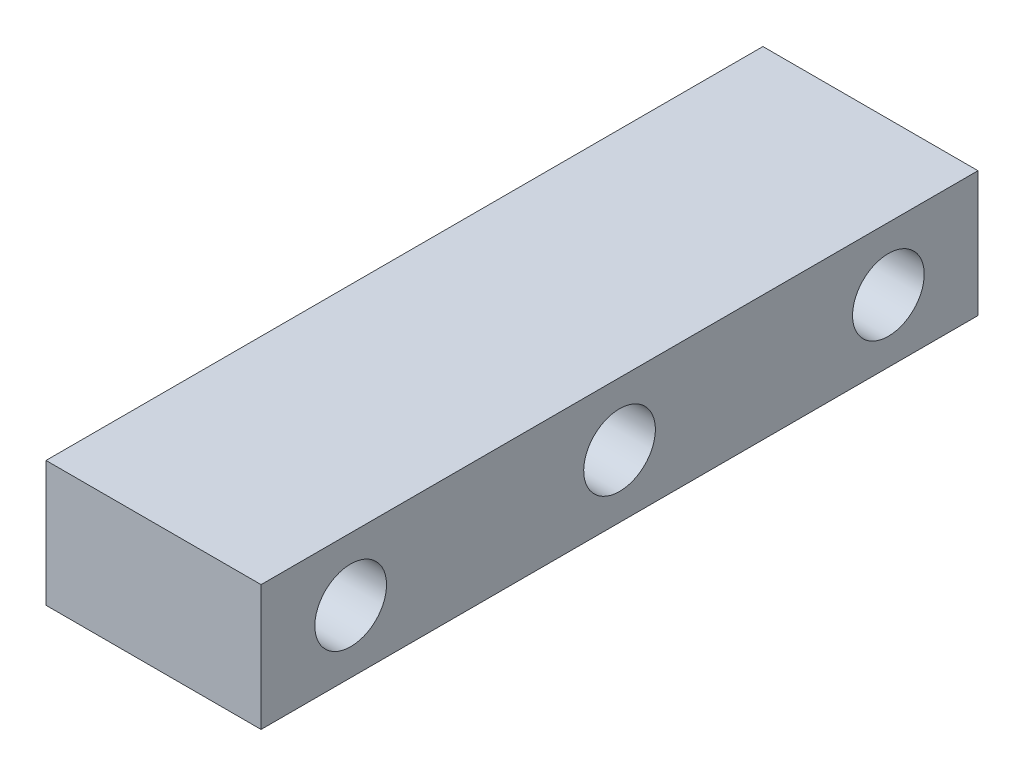
ISO-10303-21;
HEADER;
FILE_DESCRIPTION(('STEP AP214'),'2;1');
FILE_NAME('part.step','',(''),(''),'','','');
FILE_SCHEMA(('AUTOMOTIVE_DESIGN { 1 0 10303 214 1 1 1 1 }'));
ENDSEC;
DATA;
#1=APPLICATION_CONTEXT('core data for automotive mechanical design processes');
#2=APPLICATION_PROTOCOL_DEFINITION('international standard','automotive_design',2000,#1);
#3=PRODUCT_CONTEXT('',#1,'mechanical');
#4=PRODUCT('Part','Part','',(#3));
#5=PRODUCT_RELATED_PRODUCT_CATEGORY('part','',(#4));
#6=PRODUCT_DEFINITION_FORMATION('','',#4);
#7=PRODUCT_DEFINITION_CONTEXT('part definition',#1,'design');
#8=PRODUCT_DEFINITION('design','',#6,#7);
#9=PRODUCT_DEFINITION_SHAPE('','',#8);
#10=(LENGTH_UNIT() NAMED_UNIT(*) SI_UNIT(.MILLI.,.METRE.));
#11=(NAMED_UNIT(*) PLANE_ANGLE_UNIT() SI_UNIT($,.RADIAN.));
#12=(NAMED_UNIT(*) SI_UNIT($,.STERADIAN.) SOLID_ANGLE_UNIT());
#13=UNCERTAINTY_MEASURE_WITH_UNIT(LENGTH_MEASURE(1.E-05),#10,'distance_accuracy_value','');
#14=(GEOMETRIC_REPRESENTATION_CONTEXT(3) GLOBAL_UNCERTAINTY_ASSIGNED_CONTEXT((#13)) GLOBAL_UNIT_ASSIGNED_CONTEXT((#10,
#11,#12)) REPRESENTATION_CONTEXT('',''));
#15=CARTESIAN_POINT('',(0.,0.,0.));
#16=DIRECTION('',(0.,0.,1.));
#17=DIRECTION('',(1.,0.,0.));
#18=AXIS2_PLACEMENT_3D('',#15,#16,#17);
#19=CARTESIAN_POINT('',(0.,0.,90.));
#20=DIRECTION('',(1.,0.,0.));
#21=DIRECTION('',(0.,1.,0.));
#22=AXIS2_PLACEMENT_3D('',#19,#20,#21);
#23=PLANE('',#22);
#24=CARTESIAN_POINT('',(0.,-7.,75.));
#25=DIRECTION('',(-1.,0.,0.));
#26=DIRECTION('',(0.,-1.,0.));
#27=AXIS2_PLACEMENT_3D('',#24,#25,#26);
#28=CIRCLE('',#27,4.00000000000001);
#29=CARTESIAN_POINT('',(0.,-11.,75.));
#30=VERTEX_POINT('',#29);
#31=EDGE_CURVE('E92',#30,#30,#28,.T.);
#32=ORIENTED_EDGE('',*,*,#31,.F.);
#33=EDGE_LOOP('',(#32));
#34=FACE_BOUND('',#33,.T.);
#35=CARTESIAN_POINT('',(0.,-7.,45.));
#36=DIRECTION('',(-1.,0.,0.));
#37=DIRECTION('',(0.,-1.,0.));
#38=AXIS2_PLACEMENT_3D('',#35,#36,#37);
#39=CIRCLE('',#38,4.00000000000001);
#40=CARTESIAN_POINT('',(0.,-11.,45.));
#41=VERTEX_POINT('',#40);
#42=EDGE_CURVE('E99',#41,#41,#39,.T.);
#43=ORIENTED_EDGE('',*,*,#42,.F.);
#44=EDGE_LOOP('',(#43));
#45=FACE_BOUND('',#44,.T.);
#46=CARTESIAN_POINT('',(0.,-7.,15.));
#47=DIRECTION('',(-1.,0.,0.));
#48=DIRECTION('',(0.,-1.,0.));
#49=AXIS2_PLACEMENT_3D('',#46,#47,#48);
#50=CIRCLE('',#49,4.);
#51=CARTESIAN_POINT('',(0.,-11.,15.));
#52=VERTEX_POINT('',#51);
#53=EDGE_CURVE('E103',#52,#52,#50,.T.);
#54=ORIENTED_EDGE('',*,*,#53,.F.);
#55=EDGE_LOOP('',(#54));
#56=FACE_BOUND('',#55,.T.);
#57=DIRECTION('',(0.,0.,-1.));
#58=VECTOR('',#57,1.);
#59=CARTESIAN_POINT('',(0.,0.,90.));
#60=LINE('',#59,#58);
#61=CARTESIAN_POINT('',(0.,0.,85.));
#62=VERTEX_POINT('',#61);
#63=CARTESIAN_POINT('',(0.,0.,5.00000000000003));
#64=VERTEX_POINT('',#63);
#65=EDGE_CURVE('E84',#62,#64,#60,.T.);
#66=ORIENTED_EDGE('',*,*,#65,.T.);
#67=DIRECTION('',(0.,-1.,0.));
#68=VECTOR('',#67,1.);
#69=CARTESIAN_POINT('',(0.,0.,5.));
#70=LINE('',#69,#68);
#71=CARTESIAN_POINT('',(0.,-14.,5.));
#72=VERTEX_POINT('',#71);
#73=EDGE_CURVE('E46',#64,#72,#70,.T.);
#74=ORIENTED_EDGE('',*,*,#73,.T.);
#75=DIRECTION('',(0.,0.,-1.));
#76=VECTOR('',#75,1.);
#77=CARTESIAN_POINT('',(0.,-14.,90.));
#78=LINE('',#77,#76);
#79=CARTESIAN_POINT('',(0.,-14.,85.));
#80=VERTEX_POINT('',#79);
#81=EDGE_CURVE('E11',#80,#72,#78,.T.);
#82=ORIENTED_EDGE('',*,*,#81,.F.);
#83=DIRECTION('',(0.,1.,0.));
#84=VECTOR('',#83,1.);
#85=CARTESIAN_POINT('',(0.,0.,85.));
#86=LINE('',#85,#84);
#87=EDGE_CURVE('E90',#80,#62,#86,.T.);
#88=ORIENTED_EDGE('',*,*,#87,.T.);
#89=EDGE_LOOP('',(#66,#74,#82,#88));
#90=FACE_BOUND('',#89,.T.);
#91=ADVANCED_FACE('F30',(#34,#45,#56,#90),#23,.F.);
#92=CARTESIAN_POINT('',(0.,-14.,90.));
#93=DIRECTION('',(0.,1.,0.));
#94=DIRECTION('',(0.,0.,1.));
#95=AXIS2_PLACEMENT_3D('',#92,#93,#94);
#96=PLANE('',#95);
#97=ORIENTED_EDGE('',*,*,#81,.T.);
#98=DIRECTION('',(1.,0.,0.));
#99=VECTOR('',#98,1.);
#100=CARTESIAN_POINT('',(0.,-14.,5.));
#101=LINE('',#100,#99);
#102=CARTESIAN_POINT('',(24.,-14.,5.));
#103=VERTEX_POINT('',#102);
#104=EDGE_CURVE('E70',#72,#103,#101,.T.);
#105=ORIENTED_EDGE('',*,*,#104,.T.);
#106=DIRECTION('',(0.,0.,-1.));
#107=VECTOR('',#106,1.);
#108=CARTESIAN_POINT('',(24.,-14.,90.));
#109=LINE('',#108,#107);
#110=CARTESIAN_POINT('',(24.,-14.,85.));
#111=VERTEX_POINT('',#110);
#112=EDGE_CURVE('E38',#111,#103,#109,.T.);
#113=ORIENTED_EDGE('',*,*,#112,.F.);
#114=DIRECTION('',(1.,0.,0.));
#115=VECTOR('',#114,1.);
#116=CARTESIAN_POINT('',(0.,-14.,85.));
#117=LINE('',#116,#115);
#118=EDGE_CURVE('E88',#80,#111,#117,.T.);
#119=ORIENTED_EDGE('',*,*,#118,.F.);
#120=EDGE_LOOP('',(#97,#105,#113,#119));
#121=FACE_BOUND('',#120,.T.);
#122=ADVANCED_FACE('F87',(#121),#96,.F.);
#123=CARTESIAN_POINT('',(24.,0.,90.));
#124=DIRECTION('',(-1.,0.,0.));
#125=DIRECTION('',(0.,0.,1.));
#126=AXIS2_PLACEMENT_3D('',#123,#124,#125);
#127=PLANE('',#126);
#128=CARTESIAN_POINT('',(24.,-7.,75.));
#129=DIRECTION('',(-1.,0.,0.));
#130=DIRECTION('',(0.,0.,1.));
#131=AXIS2_PLACEMENT_3D('',#128,#129,#130);
#132=CIRCLE('',#131,4.00000000000001);
#133=CARTESIAN_POINT('',(24.,-11.,75.));
#134=VERTEX_POINT('',#133);
#135=EDGE_CURVE('E33',#134,#134,#132,.T.);
#136=ORIENTED_EDGE('',*,*,#135,.T.);
#137=EDGE_LOOP('',(#136));
#138=FACE_BOUND('',#137,.T.);
#139=CARTESIAN_POINT('',(24.,-7.,45.));
#140=DIRECTION('',(-1.,0.,0.));
#141=DIRECTION('',(0.,0.,1.));
#142=AXIS2_PLACEMENT_3D('',#139,#140,#141);
#143=CIRCLE('',#142,4.00000000000001);
#144=CARTESIAN_POINT('',(24.,-11.,45.));
#145=VERTEX_POINT('',#144);
#146=EDGE_CURVE('E102',#145,#145,#143,.T.);
#147=ORIENTED_EDGE('',*,*,#146,.T.);
#148=EDGE_LOOP('',(#147));
#149=FACE_BOUND('',#148,.T.);
#150=CARTESIAN_POINT('',(24.,-7.,15.));
#151=DIRECTION('',(-1.,0.,0.));
#152=DIRECTION('',(0.,0.,1.));
#153=AXIS2_PLACEMENT_3D('',#150,#151,#152);
#154=CIRCLE('',#153,4.);
#155=CARTESIAN_POINT('',(24.,-11.,15.));
#156=VERTEX_POINT('',#155);
#157=EDGE_CURVE('E106',#156,#156,#154,.T.);
#158=ORIENTED_EDGE('',*,*,#157,.T.);
#159=EDGE_LOOP('',(#158));
#160=FACE_BOUND('',#159,.T.);
#161=ORIENTED_EDGE('',*,*,#112,.T.);
#162=DIRECTION('',(0.,-1.,0.));
#163=VECTOR('',#162,1.);
#164=CARTESIAN_POINT('',(24.,0.,5.));
#165=LINE('',#164,#163);
#166=CARTESIAN_POINT('',(24.,0.,5.));
#167=VERTEX_POINT('',#166);
#168=EDGE_CURVE('E73',#167,#103,#165,.T.);
#169=ORIENTED_EDGE('',*,*,#168,.F.);
#170=DIRECTION('',(0.,0.,-1.));
#171=VECTOR('',#170,1.);
#172=CARTESIAN_POINT('',(24.,0.,90.));
#173=LINE('',#172,#171);
#174=CARTESIAN_POINT('',(24.,0.,85.));
#175=VERTEX_POINT('',#174);
#176=EDGE_CURVE('E108',#175,#167,#173,.T.);
#177=ORIENTED_EDGE('',*,*,#176,.F.);
#178=DIRECTION('',(0.,1.,0.));
#179=VECTOR('',#178,1.);
#180=CARTESIAN_POINT('',(24.,0.,85.));
#181=LINE('',#180,#179);
#182=EDGE_CURVE('E54',#111,#175,#181,.T.);
#183=ORIENTED_EDGE('',*,*,#182,.F.);
#184=EDGE_LOOP('',(#161,#169,#177,#183));
#185=FACE_BOUND('',#184,.T.);
#186=ADVANCED_FACE('F116',(#138,#149,#160,#185),#127,.F.);
#187=CARTESIAN_POINT('',(0.,0.,90.));
#188=DIRECTION('',(0.,-1.,0.));
#189=DIRECTION('',(0.,0.,-1.));
#190=AXIS2_PLACEMENT_3D('',#187,#188,#189);
#191=PLANE('',#190);
#192=ORIENTED_EDGE('',*,*,#176,.T.);
#193=DIRECTION('',(1.,0.,0.));
#194=VECTOR('',#193,1.);
#195=CARTESIAN_POINT('',(0.,0.,5.));
#196=LINE('',#195,#194);
#197=EDGE_CURVE('E77',#64,#167,#196,.T.);
#198=ORIENTED_EDGE('',*,*,#197,.F.);
#199=ORIENTED_EDGE('',*,*,#65,.F.);
#200=DIRECTION('',(1.,0.,0.));
#201=VECTOR('',#200,1.);
#202=CARTESIAN_POINT('',(0.,0.,85.));
#203=LINE('',#202,#201);
#204=EDGE_CURVE('E89',#62,#175,#203,.T.);
#205=ORIENTED_EDGE('',*,*,#204,.T.);
#206=EDGE_LOOP('',(#192,#198,#199,#205));
#207=FACE_BOUND('',#206,.T.);
#208=ADVANCED_FACE('F132',(#207),#191,.F.);
#209=CARTESIAN_POINT('',(90.,-6.99999999999999,15.));
#210=DIRECTION('',(-1.,0.,0.));
#211=DIRECTION('',(0.,-1.,0.));
#212=AXIS2_PLACEMENT_3D('',#209,#210,#211);
#213=CYLINDRICAL_SURFACE('',#212,4.);
#214=CARTESIAN_POINT('',(0.,-11.,15.));
#215=CARTESIAN_POINT('',(0.250000000000014,-11.,15.));
#216=CARTESIAN_POINT('',(0.500000000000014,-11.,15.));
#217=CARTESIAN_POINT('',(1.00000000000001,-11.,15.));
#218=CARTESIAN_POINT('',(1.25000000000002,-11.,15.));
#219=CARTESIAN_POINT('',(1.75000000000002,-11.,15.));
#220=CARTESIAN_POINT('',(2.00000000000002,-11.,15.));
#221=CARTESIAN_POINT('',(2.50000000000002,-11.,15.));
#222=CARTESIAN_POINT('',(2.75000000000002,-11.,15.));
#223=CARTESIAN_POINT('',(3.25000000000002,-11.,15.));
#224=CARTESIAN_POINT('',(3.50000000000002,-11.,15.));
#225=CARTESIAN_POINT('',(4.00000000000002,-11.,15.));
#226=CARTESIAN_POINT('',(4.25000000000002,-11.,15.));
#227=CARTESIAN_POINT('',(4.75000000000002,-11.,15.));
#228=CARTESIAN_POINT('',(5.00000000000002,-11.,15.));
#229=CARTESIAN_POINT('',(5.50000000000002,-11.,15.));
#230=CARTESIAN_POINT('',(5.75000000000002,-11.,15.));
#231=CARTESIAN_POINT('',(6.25000000000002,-11.,15.));
#232=CARTESIAN_POINT('',(6.50000000000001,-11.,15.));
#233=CARTESIAN_POINT('',(7.00000000000001,-11.,15.));
#234=CARTESIAN_POINT('',(7.25000000000001,-11.,15.));
#235=CARTESIAN_POINT('',(7.75000000000001,-11.,15.));
#236=CARTESIAN_POINT('',(8.00000000000001,-11.,15.));
#237=CARTESIAN_POINT('',(8.50000000000001,-11.,15.));
#238=CARTESIAN_POINT('',(8.75000000000001,-11.,15.));
#239=CARTESIAN_POINT('',(9.25000000000001,-11.,15.));
#240=CARTESIAN_POINT('',(9.50000000000001,-11.,15.));
#241=CARTESIAN_POINT('',(10.,-11.,15.));
#242=CARTESIAN_POINT('',(10.25,-11.,15.));
#243=CARTESIAN_POINT('',(10.75,-11.,15.));
#244=CARTESIAN_POINT('',(11.,-11.,15.));
#245=CARTESIAN_POINT('',(11.5,-11.,15.));
#246=CARTESIAN_POINT('',(11.75,-11.,15.));
#247=CARTESIAN_POINT('',(12.25,-11.,15.));
#248=CARTESIAN_POINT('',(12.5,-11.,15.));
#249=CARTESIAN_POINT('',(13.,-11.,15.));
#250=CARTESIAN_POINT('',(13.25,-11.,15.));
#251=CARTESIAN_POINT('',(13.75,-11.,15.));
#252=CARTESIAN_POINT('',(14.,-11.,15.));
#253=CARTESIAN_POINT('',(14.5,-11.,15.));
#254=CARTESIAN_POINT('',(14.75,-11.,15.));
#255=CARTESIAN_POINT('',(15.25,-11.,15.));
#256=CARTESIAN_POINT('',(15.5,-11.,15.));
#257=CARTESIAN_POINT('',(16.,-11.,15.));
#258=CARTESIAN_POINT('',(16.25,-11.,15.));
#259=CARTESIAN_POINT('',(16.75,-11.,15.));
#260=CARTESIAN_POINT('',(17.,-11.,15.));
#261=CARTESIAN_POINT('',(17.5,-11.,15.));
#262=CARTESIAN_POINT('',(17.75,-11.,15.));
#263=CARTESIAN_POINT('',(18.25,-11.,15.));
#264=CARTESIAN_POINT('',(18.5,-11.,15.));
#265=CARTESIAN_POINT('',(19.,-11.,15.));
#266=CARTESIAN_POINT('',(19.25,-11.,15.));
#267=CARTESIAN_POINT('',(19.75,-11.,15.));
#268=CARTESIAN_POINT('',(20.,-11.,15.));
#269=CARTESIAN_POINT('',(20.5,-11.,15.));
#270=CARTESIAN_POINT('',(20.75,-11.,15.));
#271=CARTESIAN_POINT('',(21.25,-11.,15.));
#272=CARTESIAN_POINT('',(21.5,-11.,15.));
#273=CARTESIAN_POINT('',(22.,-11.,15.));
#274=CARTESIAN_POINT('',(22.25,-11.,15.));
#275=CARTESIAN_POINT('',(22.75,-11.,15.));
#276=CARTESIAN_POINT('',(23.,-11.,15.));
#277=CARTESIAN_POINT('',(23.5,-11.,15.));
#278=CARTESIAN_POINT('',(23.75,-11.,15.));
#279=CARTESIAN_POINT('',(24.,-11.,15.));
#280=B_SPLINE_CURVE_WITH_KNOTS('',3,(#214,#215,#216,#217,#218,#219,#220,#221,#222,#223,#224,
#225,#226,#227,#228,#229,#230,#231,#232,#233,#234,#235,#236,#237,#238,#239,#240,#241,#242,#243,
#244,#245,#246,#247,#248,#249,#250,#251,#252,#253,#254,#255,#256,#257,#258,#259,#260,#261,#262,
#263,#264,#265,#266,#267,#268,#269,#270,#271,#272,#273,#274,#275,#276,#277,#278,#279),
.UNSPECIFIED.,.F.,.F.,(4,2,2,2,2,2,2,2,2,2,2,2,2,2,2,2,2,2,2,2,2,2,2,2,2,2,2,2,2,2,2,2,4),(0.,
0.750000000000001,1.5,2.25,3.,3.75,4.5,5.25,6.00000000000001,6.74999999999999,7.49999999999999,
8.24999999999999,8.99999999999999,9.74999999999999,10.5,11.25,12.,12.75,13.5,14.25,15.,15.75,
16.5,17.25,18.,18.75,19.5,20.25,21.,21.75,22.5,23.25,24.),.UNSPECIFIED.);
#281=EDGE_CURVE('BSEAM122',#52,#156,#280,.T.);
#282=ORIENTED_EDGE('',*,*,#53,.T.);
#283=ORIENTED_EDGE('',*,*,#157,.F.);
#284=ORIENTED_EDGE('',*,*,#281,.T.);
#285=ORIENTED_EDGE('',*,*,#281,.F.);
#286=EDGE_LOOP('',(#282,#284,#283,#285));
#287=FACE_BOUND('',#286,.T.);
#288=ADVANCED_FACE('F122',(#287),#213,.F.);
#289=CARTESIAN_POINT('',(90.,-6.99999999999999,45.));
#290=DIRECTION('',(-1.,0.,0.));
#291=DIRECTION('',(0.,-1.,0.));
#292=AXIS2_PLACEMENT_3D('',#289,#290,#291);
#293=CYLINDRICAL_SURFACE('',#292,4.00000000000001);
#294=CARTESIAN_POINT('',(0.,-11.,45.));
#295=CARTESIAN_POINT('',(0.250000000000014,-11.,45.));
#296=CARTESIAN_POINT('',(0.500000000000014,-11.,45.));
#297=CARTESIAN_POINT('',(1.00000000000001,-11.,45.));
#298=CARTESIAN_POINT('',(1.25000000000002,-11.,45.));
#299=CARTESIAN_POINT('',(1.75000000000002,-11.,45.));
#300=CARTESIAN_POINT('',(2.00000000000002,-11.,45.));
#301=CARTESIAN_POINT('',(2.50000000000002,-11.,45.));
#302=CARTESIAN_POINT('',(2.75000000000002,-11.,45.));
#303=CARTESIAN_POINT('',(3.25000000000002,-11.,45.));
#304=CARTESIAN_POINT('',(3.50000000000002,-11.,45.));
#305=CARTESIAN_POINT('',(4.00000000000002,-11.,45.));
#306=CARTESIAN_POINT('',(4.25000000000002,-11.,45.));
#307=CARTESIAN_POINT('',(4.75000000000002,-11.,45.));
#308=CARTESIAN_POINT('',(5.00000000000002,-11.,45.));
#309=CARTESIAN_POINT('',(5.50000000000002,-11.,45.));
#310=CARTESIAN_POINT('',(5.75000000000002,-11.,45.));
#311=CARTESIAN_POINT('',(6.25000000000002,-11.,45.));
#312=CARTESIAN_POINT('',(6.50000000000001,-11.,45.));
#313=CARTESIAN_POINT('',(7.00000000000001,-11.,45.));
#314=CARTESIAN_POINT('',(7.25000000000001,-11.,45.));
#315=CARTESIAN_POINT('',(7.75000000000001,-11.,45.));
#316=CARTESIAN_POINT('',(8.00000000000001,-11.,45.));
#317=CARTESIAN_POINT('',(8.50000000000001,-11.,45.));
#318=CARTESIAN_POINT('',(8.75000000000001,-11.,45.));
#319=CARTESIAN_POINT('',(9.25000000000001,-11.,45.));
#320=CARTESIAN_POINT('',(9.50000000000001,-11.,45.));
#321=CARTESIAN_POINT('',(10.,-11.,45.));
#322=CARTESIAN_POINT('',(10.25,-11.,45.));
#323=CARTESIAN_POINT('',(10.75,-11.,45.));
#324=CARTESIAN_POINT('',(11.,-11.,45.));
#325=CARTESIAN_POINT('',(11.5,-11.,45.));
#326=CARTESIAN_POINT('',(11.75,-11.,45.));
#327=CARTESIAN_POINT('',(12.25,-11.,45.));
#328=CARTESIAN_POINT('',(12.5,-11.,45.));
#329=CARTESIAN_POINT('',(13.,-11.,45.));
#330=CARTESIAN_POINT('',(13.25,-11.,45.));
#331=CARTESIAN_POINT('',(13.75,-11.,45.));
#332=CARTESIAN_POINT('',(14.,-11.,45.));
#333=CARTESIAN_POINT('',(14.5,-11.,45.));
#334=CARTESIAN_POINT('',(14.75,-11.,45.));
#335=CARTESIAN_POINT('',(15.25,-11.,45.));
#336=CARTESIAN_POINT('',(15.5,-11.,45.));
#337=CARTESIAN_POINT('',(16.,-11.,45.));
#338=CARTESIAN_POINT('',(16.25,-11.,45.));
#339=CARTESIAN_POINT('',(16.75,-11.,45.));
#340=CARTESIAN_POINT('',(17.,-11.,45.));
#341=CARTESIAN_POINT('',(17.5,-11.,45.));
#342=CARTESIAN_POINT('',(17.75,-11.,45.));
#343=CARTESIAN_POINT('',(18.25,-11.,45.));
#344=CARTESIAN_POINT('',(18.5,-11.,45.));
#345=CARTESIAN_POINT('',(19.,-11.,45.));
#346=CARTESIAN_POINT('',(19.25,-11.,45.));
#347=CARTESIAN_POINT('',(19.75,-11.,45.));
#348=CARTESIAN_POINT('',(20.,-11.,45.));
#349=CARTESIAN_POINT('',(20.5,-11.,45.));
#350=CARTESIAN_POINT('',(20.75,-11.,45.));
#351=CARTESIAN_POINT('',(21.25,-11.,45.));
#352=CARTESIAN_POINT('',(21.5,-11.,45.));
#353=CARTESIAN_POINT('',(22.,-11.,45.));
#354=CARTESIAN_POINT('',(22.25,-11.,45.));
#355=CARTESIAN_POINT('',(22.75,-11.,45.));
#356=CARTESIAN_POINT('',(23.,-11.,45.));
#357=CARTESIAN_POINT('',(23.5,-11.,45.));
#358=CARTESIAN_POINT('',(23.75,-11.,45.));
#359=CARTESIAN_POINT('',(24.,-11.,45.));
#360=B_SPLINE_CURVE_WITH_KNOTS('',3,(#294,#295,#296,#297,#298,#299,#300,#301,#302,#303,#304,
#305,#306,#307,#308,#309,#310,#311,#312,#313,#314,#315,#316,#317,#318,#319,#320,#321,#322,#323,
#324,#325,#326,#327,#328,#329,#330,#331,#332,#333,#334,#335,#336,#337,#338,#339,#340,#341,#342,
#343,#344,#345,#346,#347,#348,#349,#350,#351,#352,#353,#354,#355,#356,#357,#358,#359),
.UNSPECIFIED.,.F.,.F.,(4,2,2,2,2,2,2,2,2,2,2,2,2,2,2,2,2,2,2,2,2,2,2,2,2,2,2,2,2,2,2,2,4),(0.,
0.750000000000001,1.5,2.25,3.,3.75,4.5,5.25,6.00000000000001,6.74999999999999,7.49999999999999,
8.24999999999999,8.99999999999999,9.74999999999999,10.5,11.25,12.,12.75,13.5,14.25,15.,15.75,
16.5,17.25,18.,18.75,19.5,20.25,21.,21.75,22.5,23.25,24.),.UNSPECIFIED.);
#361=EDGE_CURVE('BSEAM119',#41,#145,#360,.T.);
#362=ORIENTED_EDGE('',*,*,#42,.T.);
#363=ORIENTED_EDGE('',*,*,#146,.F.);
#364=ORIENTED_EDGE('',*,*,#361,.T.);
#365=ORIENTED_EDGE('',*,*,#361,.F.);
#366=EDGE_LOOP('',(#362,#364,#363,#365));
#367=FACE_BOUND('',#366,.T.);
#368=ADVANCED_FACE('F119',(#367),#293,.F.);
#369=CARTESIAN_POINT('',(90.,-6.99999999999999,75.));
#370=DIRECTION('',(-1.,0.,0.));
#371=DIRECTION('',(0.,-1.,0.));
#372=AXIS2_PLACEMENT_3D('',#369,#370,#371);
#373=CYLINDRICAL_SURFACE('',#372,4.00000000000001);
#374=CARTESIAN_POINT('',(0.,-11.,75.));
#375=CARTESIAN_POINT('',(0.250000000000014,-11.,75.));
#376=CARTESIAN_POINT('',(0.500000000000014,-11.,75.));
#377=CARTESIAN_POINT('',(1.00000000000001,-11.,75.));
#378=CARTESIAN_POINT('',(1.25000000000002,-11.,75.));
#379=CARTESIAN_POINT('',(1.75000000000002,-11.,75.));
#380=CARTESIAN_POINT('',(2.00000000000002,-11.,75.));
#381=CARTESIAN_POINT('',(2.50000000000002,-11.,75.));
#382=CARTESIAN_POINT('',(2.75000000000002,-11.,75.));
#383=CARTESIAN_POINT('',(3.25000000000002,-11.,75.));
#384=CARTESIAN_POINT('',(3.50000000000002,-11.,75.));
#385=CARTESIAN_POINT('',(4.00000000000002,-11.,75.));
#386=CARTESIAN_POINT('',(4.25000000000002,-11.,75.));
#387=CARTESIAN_POINT('',(4.75000000000002,-11.,75.));
#388=CARTESIAN_POINT('',(5.00000000000002,-11.,75.));
#389=CARTESIAN_POINT('',(5.50000000000002,-11.,75.));
#390=CARTESIAN_POINT('',(5.75000000000002,-11.,75.));
#391=CARTESIAN_POINT('',(6.25000000000002,-11.,75.));
#392=CARTESIAN_POINT('',(6.50000000000001,-11.,75.));
#393=CARTESIAN_POINT('',(7.00000000000001,-11.,75.));
#394=CARTESIAN_POINT('',(7.25000000000001,-11.,75.));
#395=CARTESIAN_POINT('',(7.75000000000001,-11.,75.));
#396=CARTESIAN_POINT('',(8.00000000000001,-11.,75.));
#397=CARTESIAN_POINT('',(8.50000000000001,-11.,75.));
#398=CARTESIAN_POINT('',(8.75000000000001,-11.,75.));
#399=CARTESIAN_POINT('',(9.25000000000001,-11.,75.));
#400=CARTESIAN_POINT('',(9.50000000000001,-11.,75.));
#401=CARTESIAN_POINT('',(10.,-11.,75.));
#402=CARTESIAN_POINT('',(10.25,-11.,75.));
#403=CARTESIAN_POINT('',(10.75,-11.,75.));
#404=CARTESIAN_POINT('',(11.,-11.,75.));
#405=CARTESIAN_POINT('',(11.5,-11.,75.));
#406=CARTESIAN_POINT('',(11.75,-11.,75.));
#407=CARTESIAN_POINT('',(12.25,-11.,75.));
#408=CARTESIAN_POINT('',(12.5,-11.,75.));
#409=CARTESIAN_POINT('',(13.,-11.,75.));
#410=CARTESIAN_POINT('',(13.25,-11.,75.));
#411=CARTESIAN_POINT('',(13.75,-11.,75.));
#412=CARTESIAN_POINT('',(14.,-11.,75.));
#413=CARTESIAN_POINT('',(14.5,-11.,75.));
#414=CARTESIAN_POINT('',(14.75,-11.,75.));
#415=CARTESIAN_POINT('',(15.25,-11.,75.));
#416=CARTESIAN_POINT('',(15.5,-11.,75.));
#417=CARTESIAN_POINT('',(16.,-11.,75.));
#418=CARTESIAN_POINT('',(16.25,-11.,75.));
#419=CARTESIAN_POINT('',(16.75,-11.,75.));
#420=CARTESIAN_POINT('',(17.,-11.,75.));
#421=CARTESIAN_POINT('',(17.5,-11.,75.));
#422=CARTESIAN_POINT('',(17.75,-11.,75.));
#423=CARTESIAN_POINT('',(18.25,-11.,75.));
#424=CARTESIAN_POINT('',(18.5,-11.,75.));
#425=CARTESIAN_POINT('',(19.,-11.,75.));
#426=CARTESIAN_POINT('',(19.25,-11.,75.));
#427=CARTESIAN_POINT('',(19.75,-11.,75.));
#428=CARTESIAN_POINT('',(20.,-11.,75.));
#429=CARTESIAN_POINT('',(20.5,-11.,75.));
#430=CARTESIAN_POINT('',(20.75,-11.,75.));
#431=CARTESIAN_POINT('',(21.25,-11.,75.));
#432=CARTESIAN_POINT('',(21.5,-11.,75.));
#433=CARTESIAN_POINT('',(22.,-11.,75.));
#434=CARTESIAN_POINT('',(22.25,-11.,75.));
#435=CARTESIAN_POINT('',(22.75,-11.,75.));
#436=CARTESIAN_POINT('',(23.,-11.,75.));
#437=CARTESIAN_POINT('',(23.5,-11.,75.));
#438=CARTESIAN_POINT('',(23.75,-11.,75.));
#439=CARTESIAN_POINT('',(24.,-11.,75.));
#440=B_SPLINE_CURVE_WITH_KNOTS('',3,(#374,#375,#376,#377,#378,#379,#380,#381,#382,#383,#384,
#385,#386,#387,#388,#389,#390,#391,#392,#393,#394,#395,#396,#397,#398,#399,#400,#401,#402,#403,
#404,#405,#406,#407,#408,#409,#410,#411,#412,#413,#414,#415,#416,#417,#418,#419,#420,#421,#422,
#423,#424,#425,#426,#427,#428,#429,#430,#431,#432,#433,#434,#435,#436,#437,#438,#439),
.UNSPECIFIED.,.F.,.F.,(4,2,2,2,2,2,2,2,2,2,2,2,2,2,2,2,2,2,2,2,2,2,2,2,2,2,2,2,2,2,2,2,4),(0.,
0.750000000000001,1.5,2.25,3.,3.75,4.5,5.25,6.00000000000001,6.74999999999999,7.49999999999999,
8.24999999999999,8.99999999999999,9.74999999999999,10.5,11.25,12.,12.75,13.5,14.25,15.,15.75,
16.5,17.25,18.,18.75,19.5,20.25,21.,21.75,22.5,23.25,24.),.UNSPECIFIED.);
#441=EDGE_CURVE('BSEAM121',#30,#134,#440,.T.);
#442=ORIENTED_EDGE('',*,*,#31,.T.);
#443=ORIENTED_EDGE('',*,*,#135,.F.);
#444=ORIENTED_EDGE('',*,*,#441,.T.);
#445=ORIENTED_EDGE('',*,*,#441,.F.);
#446=EDGE_LOOP('',(#442,#444,#443,#445));
#447=FACE_BOUND('',#446,.T.);
#448=ADVANCED_FACE('F121',(#447),#373,.F.);
#449=CARTESIAN_POINT('',(0.,0.,85.));
#450=DIRECTION('',(0.,0.,-1.));
#451=DIRECTION('',(-1.,0.,0.));
#452=AXIS2_PLACEMENT_3D('',#449,#450,#451);
#453=PLANE('',#452);
#454=ORIENTED_EDGE('',*,*,#182,.T.);
#455=ORIENTED_EDGE('',*,*,#204,.F.);
#456=ORIENTED_EDGE('',*,*,#87,.F.);
#457=ORIENTED_EDGE('',*,*,#118,.T.);
#458=EDGE_LOOP('',(#454,#455,#456,#457));
#459=FACE_BOUND('',#458,.T.);
#460=ADVANCED_FACE('F129',(#459),#453,.F.);
#461=CARTESIAN_POINT('',(0.,0.,5.));
#462=DIRECTION('',(0.,0.,1.));
#463=DIRECTION('',(0.,-1.,0.));
#464=AXIS2_PLACEMENT_3D('',#461,#462,#463);
#465=PLANE('',#464);
#466=ORIENTED_EDGE('',*,*,#168,.T.);
#467=ORIENTED_EDGE('',*,*,#104,.F.);
#468=ORIENTED_EDGE('',*,*,#73,.F.);
#469=ORIENTED_EDGE('',*,*,#197,.T.);
#470=EDGE_LOOP('',(#466,#467,#468,#469));
#471=FACE_BOUND('',#470,.T.);
#472=ADVANCED_FACE('F71',(#471),#465,.F.);
#473=CLOSED_SHELL('',(#91,#122,#186,#208,#288,#368,#448,#460,#472));
#474=MANIFOLD_SOLID_BREP('B2',#473);
#475=ADVANCED_BREP_SHAPE_REPRESENTATION('',(#18,#474),#14);
#476=SHAPE_DEFINITION_REPRESENTATION(#9,#475);
ENDSEC;
END-ISO-10303-21;
